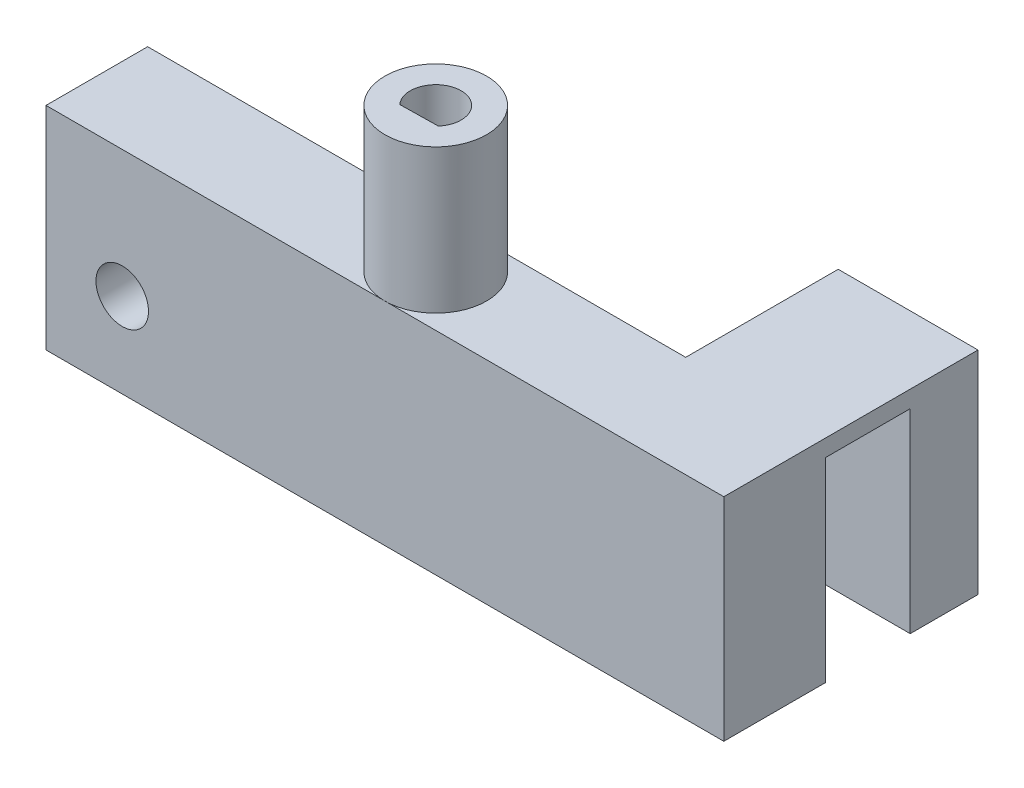
ISO-10303-21;
HEADER;
FILE_DESCRIPTION(('STEP AP214'),'2;1');
FILE_NAME('part.step','',(''),(''),'','','');
FILE_SCHEMA(('AUTOMOTIVE_DESIGN { 1 0 10303 214 1 1 1 1 }'));
ENDSEC;
DATA;
#1=APPLICATION_CONTEXT('core data for automotive mechanical design processes');
#2=APPLICATION_PROTOCOL_DEFINITION('international standard','automotive_design',2000,#1);
#3=PRODUCT_CONTEXT('',#1,'mechanical');
#4=PRODUCT('Part','Part','',(#3));
#5=PRODUCT_RELATED_PRODUCT_CATEGORY('part','',(#4));
#6=PRODUCT_DEFINITION_FORMATION('','',#4);
#7=PRODUCT_DEFINITION_CONTEXT('part definition',#1,'design');
#8=PRODUCT_DEFINITION('design','',#6,#7);
#9=PRODUCT_DEFINITION_SHAPE('','',#8);
#10=(LENGTH_UNIT() NAMED_UNIT(*) SI_UNIT(.MILLI.,.METRE.));
#11=(NAMED_UNIT(*) PLANE_ANGLE_UNIT() SI_UNIT($,.RADIAN.));
#12=(NAMED_UNIT(*) SI_UNIT($,.STERADIAN.) SOLID_ANGLE_UNIT());
#13=UNCERTAINTY_MEASURE_WITH_UNIT(LENGTH_MEASURE(1.E-05),#10,'distance_accuracy_value','');
#14=(GEOMETRIC_REPRESENTATION_CONTEXT(3) GLOBAL_UNCERTAINTY_ASSIGNED_CONTEXT((#13)) GLOBAL_UNIT_ASSIGNED_CONTEXT((#10,
#11,#12)) REPRESENTATION_CONTEXT('',''));
#15=CARTESIAN_POINT('',(0.,0.,0.));
#16=DIRECTION('',(0.,0.,1.));
#17=DIRECTION('',(1.,0.,0.));
#18=AXIS2_PLACEMENT_3D('',#15,#16,#17);
#19=CARTESIAN_POINT('',(0.,-12.5,0.));
#20=DIRECTION('',(0.,1.,0.));
#21=DIRECTION('',(0.,0.,1.));
#22=AXIS2_PLACEMENT_3D('',#19,#20,#21);
#23=PLANE('',#22);
#24=DIRECTION('',(1.,0.,0.));
#25=VECTOR('',#24,1.);
#26=CARTESIAN_POINT('',(-20.,-12.5,-3.));
#27=LINE('',#26,#25);
#28=CARTESIAN_POINT('',(-20.,-12.5,-3.));
#29=VERTEX_POINT('',#28);
#30=CARTESIAN_POINT('',(20.,-12.5,-3.));
#31=VERTEX_POINT('',#30);
#32=EDGE_CURVE('E185',#29,#31,#27,.T.);
#33=ORIENTED_EDGE('',*,*,#32,.T.);
#34=DIRECTION('',(0.,0.,1.));
#35=VECTOR('',#34,1.);
#36=CARTESIAN_POINT('',(20.,-12.5,-3.));
#37=LINE('',#36,#35);
#38=CARTESIAN_POINT('',(20.,-12.5,3.));
#39=VERTEX_POINT('',#38);
#40=EDGE_CURVE('E181',#31,#39,#37,.T.);
#41=ORIENTED_EDGE('',*,*,#40,.T.);
#42=DIRECTION('',(-1.,0.,0.));
#43=VECTOR('',#42,1.);
#44=CARTESIAN_POINT('',(-20.,-12.5,3.));
#45=LINE('',#44,#43);
#46=CARTESIAN_POINT('',(-20.,-12.5,3.));
#47=VERTEX_POINT('',#46);
#48=EDGE_CURVE('E180',#39,#47,#45,.T.);
#49=ORIENTED_EDGE('',*,*,#48,.T.);
#50=DIRECTION('',(0.,0.,-1.));
#51=VECTOR('',#50,1.);
#52=CARTESIAN_POINT('',(-20.,-12.5,-3.));
#53=LINE('',#52,#51);
#54=EDGE_CURVE('E183',#47,#29,#53,.T.);
#55=ORIENTED_EDGE('',*,*,#54,.T.);
#56=EDGE_LOOP('',(#33,#41,#49,#55));
#57=FACE_BOUND('',#56,.T.);
#58=ADVANCED_FACE('F38',(#57),#23,.F.);
#59=CARTESIAN_POINT('',(-20.,-12.5,-3.));
#60=DIRECTION('',(0.,0.,1.));
#61=DIRECTION('',(1.,0.,0.));
#62=AXIS2_PLACEMENT_3D('',#59,#60,#61);
#63=PLANE('',#62);
#64=CARTESIAN_POINT('',(-15.5,-7.5,-3.));
#65=DIRECTION('',(0.,0.,-1.));
#66=DIRECTION('',(-1.,0.,0.));
#67=AXIS2_PLACEMENT_3D('',#64,#65,#66);
#68=CIRCLE('',#67,1.55);
#69=CARTESIAN_POINT('',(-17.05,-7.5,-3.));
#70=VERTEX_POINT('',#69);
#71=EDGE_CURVE('E170',#70,#70,#68,.T.);
#72=ORIENTED_EDGE('',*,*,#71,.F.);
#73=EDGE_LOOP('',(#72));
#74=FACE_BOUND('',#73,.T.);
#75=DIRECTION('',(0.,1.,0.));
#76=VECTOR('',#75,1.);
#77=CARTESIAN_POINT('',(11.75,-12.5,-3.));
#78=LINE('',#77,#76);
#79=CARTESIAN_POINT('',(11.75,-1.,-3.));
#80=VERTEX_POINT('',#79);
#81=CARTESIAN_POINT('',(11.75,0.,-3.));
#82=VERTEX_POINT('',#81);
#83=EDGE_CURVE('E158',#80,#82,#78,.T.);
#84=ORIENTED_EDGE('',*,*,#83,.F.);
#85=DIRECTION('',(-1.,0.,0.));
#86=VECTOR('',#85,1.);
#87=CARTESIAN_POINT('',(11.75,-1.,-3.));
#88=LINE('',#87,#86);
#89=CARTESIAN_POINT('',(20.,-1.,-3.));
#90=VERTEX_POINT('',#89);
#91=EDGE_CURVE('E53',#90,#80,#88,.T.);
#92=ORIENTED_EDGE('',*,*,#91,.F.);
#93=DIRECTION('',(0.,-1.,0.));
#94=VECTOR('',#93,1.);
#95=CARTESIAN_POINT('',(20.,-1.,-3.));
#96=LINE('',#95,#94);
#97=EDGE_CURVE('E149',#90,#31,#96,.T.);
#98=ORIENTED_EDGE('',*,*,#97,.T.);
#99=ORIENTED_EDGE('',*,*,#32,.F.);
#100=DIRECTION('',(0.,1.,0.));
#101=VECTOR('',#100,1.);
#102=CARTESIAN_POINT('',(-20.,-12.5,-3.));
#103=LINE('',#102,#101);
#104=CARTESIAN_POINT('',(-20.,0.,-3.));
#105=VERTEX_POINT('',#104);
#106=EDGE_CURVE('E187',#29,#105,#103,.T.);
#107=ORIENTED_EDGE('',*,*,#106,.T.);
#108=DIRECTION('',(1.,0.,0.));
#109=VECTOR('',#108,1.);
#110=CARTESIAN_POINT('',(-20.,0.,-3.));
#111=LINE('',#110,#109);
#112=CARTESIAN_POINT('',(0.,0.,-3.));
#113=VERTEX_POINT('',#112);
#114=EDGE_CURVE('E195',#105,#113,#111,.T.);
#115=ORIENTED_EDGE('',*,*,#114,.T.);
#116=EDGE_CURVE('E194',#113,#82,#111,.T.);
#117=ORIENTED_EDGE('',*,*,#116,.T.);
#118=EDGE_LOOP('',(#84,#92,#98,#99,#107,#115,#117));
#119=FACE_BOUND('',#118,.T.);
#120=ADVANCED_FACE('F247',(#74,#119),#63,.F.);
#121=CARTESIAN_POINT('',(0.,8.5,0.));
#122=DIRECTION('',(0.,-1.,0.));
#123=DIRECTION('',(0.,0.,-1.));
#124=AXIS2_PLACEMENT_3D('',#121,#122,#123);
#125=CYLINDRICAL_SURFACE('',#124,3.);
#126=CARTESIAN_POINT('',(0.,8.5,0.));
#127=DIRECTION('',(0.,1.,0.));
#128=DIRECTION('',(0.,0.,1.));
#129=AXIS2_PLACEMENT_3D('',#126,#127,#128);
#130=CIRCLE('',#129,3.);
#131=CARTESIAN_POINT('',(0.,8.5,3.));
#132=VERTEX_POINT('',#131);
#133=EDGE_CURVE('E11',#132,#132,#130,.T.);
#134=ORIENTED_EDGE('',*,*,#133,.F.);
#135=EDGE_LOOP('',(#134));
#136=FACE_BOUND('',#135,.T.);
#137=CARTESIAN_POINT('',(0.,0.,0.));
#138=DIRECTION('',(0.,1.,0.));
#139=DIRECTION('',(0.,0.,1.));
#140=AXIS2_PLACEMENT_3D('',#137,#138,#139);
#141=CIRCLE('',#140,3.);
#142=CARTESIAN_POINT('',(0.,0.,3.));
#143=VERTEX_POINT('',#142);
#144=EDGE_CURVE('E42',#143,#113,#141,.T.);
#145=ORIENTED_EDGE('',*,*,#144,.T.);
#146=EDGE_CURVE('E219',#113,#143,#141,.T.);
#147=ORIENTED_EDGE('',*,*,#146,.T.);
#148=EDGE_LOOP('',(#145,#147));
#149=FACE_BOUND('',#148,.T.);
#150=ADVANCED_FACE('F40',(#136,#149),#125,.T.);
#151=CARTESIAN_POINT('',(0.,8.5,0.));
#152=DIRECTION('',(0.,1.,0.));
#153=DIRECTION('',(0.,0.,1.));
#154=AXIS2_PLACEMENT_3D('',#151,#152,#153);
#155=PLANE('',#154);
#156=CARTESIAN_POINT('',(0.,8.5,0.));
#157=DIRECTION('',(0.,1.,0.));
#158=DIRECTION('',(0.,0.,1.));
#159=AXIS2_PLACEMENT_3D('',#156,#157,#158);
#160=CIRCLE('',#159,1.5);
#161=CARTESIAN_POINT('',(1.13442926526062,8.5,0.981361422779732));
#162=VERTEX_POINT('',#161);
#163=CARTESIAN_POINT('',(-1.10133251917624,8.5,1.01836470981909));
#164=VERTEX_POINT('',#163);
#165=EDGE_CURVE('E205',#162,#164,#160,.T.);
#166=ORIENTED_EDGE('',*,*,#165,.F.);
#167=DIRECTION('',(0.999863066299409,0.,-0.0165483730421872));
#168=VECTOR('',#167,1.);
#169=CARTESIAN_POINT('',(-1.10133251917624,8.5,1.01836470981909));
#170=LINE('',#169,#168);
#171=EDGE_CURVE('E210',#164,#162,#170,.T.);
#172=ORIENTED_EDGE('',*,*,#171,.F.);
#173=EDGE_LOOP('',(#166,#172));
#174=FACE_BOUND('',#173,.T.);
#175=ORIENTED_EDGE('',*,*,#133,.T.);
#176=EDGE_LOOP('',(#175));
#177=FACE_BOUND('',#176,.T.);
#178=ADVANCED_FACE('F229',(#174,#177),#155,.T.);
#179=CARTESIAN_POINT('',(0.,2.5,0.));
#180=DIRECTION('',(0.,1.,0.));
#181=DIRECTION('',(0.,0.,1.));
#182=AXIS2_PLACEMENT_3D('',#179,#180,#181);
#183=CYLINDRICAL_SURFACE('',#182,1.5);
#184=ORIENTED_EDGE('',*,*,#165,.T.);
#185=DIRECTION('',(0.,1.,0.));
#186=VECTOR('',#185,1.);
#187=CARTESIAN_POINT('',(-1.10133251917624,2.5,1.01836470981909));
#188=LINE('',#187,#186);
#189=CARTESIAN_POINT('',(-1.10133251917624,2.5,1.01836470981909));
#190=VERTEX_POINT('',#189);
#191=EDGE_CURVE('E213',#190,#164,#188,.T.);
#192=ORIENTED_EDGE('',*,*,#191,.F.);
#193=CARTESIAN_POINT('',(0.,2.5,0.));
#194=DIRECTION('',(0.,1.,0.));
#195=DIRECTION('',(0.,0.,1.));
#196=AXIS2_PLACEMENT_3D('',#193,#194,#195);
#197=CIRCLE('',#196,1.5);
#198=CARTESIAN_POINT('',(1.13442926526062,2.5,0.981361422779732));
#199=VERTEX_POINT('',#198);
#200=EDGE_CURVE('E206',#199,#190,#197,.T.);
#201=ORIENTED_EDGE('',*,*,#200,.F.);
#202=DIRECTION('',(0.,1.,0.));
#203=VECTOR('',#202,1.);
#204=CARTESIAN_POINT('',(1.13442926526062,2.5,0.981361422779732));
#205=LINE('',#204,#203);
#206=EDGE_CURVE('E217',#199,#162,#205,.T.);
#207=ORIENTED_EDGE('',*,*,#206,.T.);
#208=EDGE_LOOP('',(#184,#192,#201,#207));
#209=FACE_BOUND('',#208,.T.);
#210=ADVANCED_FACE('F231',(#209),#183,.F.);
#211=CARTESIAN_POINT('',(-1.10133251917624,2.5,1.01836470981909));
#212=DIRECTION('',(0.0165483730421872,0.,0.999863066299409));
#213=DIRECTION('',(0.999863066299409,0.,-0.0165483730421872));
#214=AXIS2_PLACEMENT_3D('',#211,#212,#213);
#215=PLANE('',#214);
#216=ORIENTED_EDGE('',*,*,#171,.T.);
#217=ORIENTED_EDGE('',*,*,#206,.F.);
#218=DIRECTION('',(0.999863066299409,0.,-0.0165483730421872));
#219=VECTOR('',#218,1.);
#220=CARTESIAN_POINT('',(-1.10133251917624,2.5,1.01836470981909));
#221=LINE('',#220,#219);
#222=EDGE_CURVE('E209',#190,#199,#221,.T.);
#223=ORIENTED_EDGE('',*,*,#222,.F.);
#224=ORIENTED_EDGE('',*,*,#191,.T.);
#225=EDGE_LOOP('',(#216,#217,#223,#224));
#226=FACE_BOUND('',#225,.T.);
#227=ADVANCED_FACE('F224',(#226),#215,.F.);
#228=CARTESIAN_POINT('',(0.,2.5,0.));
#229=DIRECTION('',(0.,1.,0.));
#230=DIRECTION('',(0.,0.,1.));
#231=AXIS2_PLACEMENT_3D('',#228,#229,#230);
#232=PLANE('',#231);
#233=ORIENTED_EDGE('',*,*,#200,.T.);
#234=ORIENTED_EDGE('',*,*,#222,.T.);
#235=EDGE_LOOP('',(#233,#234));
#236=FACE_BOUND('',#235,.T.);
#237=ADVANCED_FACE('F233',(#236),#232,.T.);
#238=CARTESIAN_POINT('',(0.,0.,0.));
#239=DIRECTION('',(0.,1.,0.));
#240=DIRECTION('',(0.,0.,1.));
#241=AXIS2_PLACEMENT_3D('',#238,#239,#240);
#242=PLANE('',#241);
#243=ORIENTED_EDGE('',*,*,#144,.F.);
#244=DIRECTION('',(-1.,0.,0.));
#245=VECTOR('',#244,1.);
#246=CARTESIAN_POINT('',(-20.,0.,3.));
#247=LINE('',#246,#245);
#248=CARTESIAN_POINT('',(20.,0.,3.));
#249=VERTEX_POINT('',#248);
#250=EDGE_CURVE('E61',#249,#143,#247,.T.);
#251=ORIENTED_EDGE('',*,*,#250,.F.);
#252=DIRECTION('',(0.,0.,1.));
#253=VECTOR('',#252,1.);
#254=CARTESIAN_POINT('',(20.,0.,-3.));
#255=LINE('',#254,#253);
#256=CARTESIAN_POINT('',(20.,0.,-12.));
#257=VERTEX_POINT('',#256);
#258=EDGE_CURVE('E174',#257,#249,#255,.T.);
#259=ORIENTED_EDGE('',*,*,#258,.F.);
#260=DIRECTION('',(1.,0.,0.));
#261=VECTOR('',#260,1.);
#262=CARTESIAN_POINT('',(20.,0.,-12.));
#263=LINE('',#262,#261);
#264=CARTESIAN_POINT('',(11.75,0.,-12.));
#265=VERTEX_POINT('',#264);
#266=EDGE_CURVE('E162',#265,#257,#263,.T.);
#267=ORIENTED_EDGE('',*,*,#266,.F.);
#268=DIRECTION('',(0.,0.,1.));
#269=VECTOR('',#268,1.);
#270=CARTESIAN_POINT('',(11.75,0.,-12.));
#271=LINE('',#270,#269);
#272=EDGE_CURVE('E165',#265,#82,#271,.T.);
#273=ORIENTED_EDGE('',*,*,#272,.T.);
#274=ORIENTED_EDGE('',*,*,#116,.F.);
#275=EDGE_LOOP('',(#243,#251,#259,#267,#273,#274));
#276=FACE_BOUND('',#275,.T.);
#277=ADVANCED_FACE('F235',(#276),#242,.T.);
#278=ORIENTED_EDGE('',*,*,#146,.F.);
#279=ORIENTED_EDGE('',*,*,#114,.F.);
#280=DIRECTION('',(0.,0.,-1.));
#281=VECTOR('',#280,1.);
#282=CARTESIAN_POINT('',(-20.,0.,-3.));
#283=LINE('',#282,#281);
#284=CARTESIAN_POINT('',(-20.,0.,3.));
#285=VERTEX_POINT('',#284);
#286=EDGE_CURVE('E192',#285,#105,#283,.T.);
#287=ORIENTED_EDGE('',*,*,#286,.F.);
#288=EDGE_CURVE('E190',#143,#285,#247,.T.);
#289=ORIENTED_EDGE('',*,*,#288,.F.);
#290=EDGE_LOOP('',(#278,#279,#287,#289));
#291=FACE_BOUND('',#290,.T.);
#292=ADVANCED_FACE('F241',(#291),#242,.T.);
#293=CARTESIAN_POINT('',(20.,-12.5,-3.));
#294=DIRECTION('',(-1.,0.,0.));
#295=DIRECTION('',(0.,0.,1.));
#296=AXIS2_PLACEMENT_3D('',#293,#294,#295);
#297=PLANE('',#296);
#298=ORIENTED_EDGE('',*,*,#40,.F.);
#299=ORIENTED_EDGE('',*,*,#97,.F.);
#300=DIRECTION('',(0.,0.,1.));
#301=VECTOR('',#300,1.);
#302=CARTESIAN_POINT('',(20.,-1.,-3.));
#303=LINE('',#302,#301);
#304=CARTESIAN_POINT('',(20.,-1.,-8.));
#305=VERTEX_POINT('',#304);
#306=EDGE_CURVE('E135',#305,#90,#303,.T.);
#307=ORIENTED_EDGE('',*,*,#306,.F.);
#308=DIRECTION('',(0.,-1.,0.));
#309=VECTOR('',#308,1.);
#310=CARTESIAN_POINT('',(20.,-1.,-8.));
#311=LINE('',#310,#309);
#312=CARTESIAN_POINT('',(20.,-12.5,-8.));
#313=VERTEX_POINT('',#312);
#314=EDGE_CURVE('E133',#305,#313,#311,.T.);
#315=ORIENTED_EDGE('',*,*,#314,.T.);
#316=CARTESIAN_POINT('',(20.,-12.5,-12.));
#317=VERTEX_POINT('',#316);
#318=EDGE_CURVE('E177',#317,#313,#37,.T.);
#319=ORIENTED_EDGE('',*,*,#318,.F.);
#320=DIRECTION('',(0.,-1.,0.));
#321=VECTOR('',#320,1.);
#322=CARTESIAN_POINT('',(20.,-12.5,-12.));
#323=LINE('',#322,#321);
#324=EDGE_CURVE('E154',#257,#317,#323,.T.);
#325=ORIENTED_EDGE('',*,*,#324,.F.);
#326=ORIENTED_EDGE('',*,*,#258,.T.);
#327=DIRECTION('',(0.,1.,0.));
#328=VECTOR('',#327,1.);
#329=CARTESIAN_POINT('',(20.,-12.5,3.));
#330=LINE('',#329,#328);
#331=EDGE_CURVE('E203',#39,#249,#330,.T.);
#332=ORIENTED_EDGE('',*,*,#331,.F.);
#333=EDGE_LOOP('',(#298,#299,#307,#315,#319,#325,#326,#332));
#334=FACE_BOUND('',#333,.T.);
#335=ADVANCED_FACE('F273',(#334),#297,.F.);
#336=CARTESIAN_POINT('',(-20.,-12.5,3.));
#337=DIRECTION('',(0.,0.,-1.));
#338=DIRECTION('',(-1.,0.,0.));
#339=AXIS2_PLACEMENT_3D('',#336,#337,#338);
#340=PLANE('',#339);
#341=CARTESIAN_POINT('',(-15.5,-7.5,3.));
#342=DIRECTION('',(0.,0.,-1.));
#343=DIRECTION('',(-1.,0.,0.));
#344=AXIS2_PLACEMENT_3D('',#341,#342,#343);
#345=CIRCLE('',#344,1.55);
#346=CARTESIAN_POINT('',(-17.05,-7.5,3.));
#347=VERTEX_POINT('',#346);
#348=EDGE_CURVE('E171',#347,#347,#345,.T.);
#349=ORIENTED_EDGE('',*,*,#348,.T.);
#350=EDGE_LOOP('',(#349));
#351=FACE_BOUND('',#350,.T.);
#352=ORIENTED_EDGE('',*,*,#250,.T.);
#353=ORIENTED_EDGE('',*,*,#288,.T.);
#354=DIRECTION('',(0.,1.,0.));
#355=VECTOR('',#354,1.);
#356=CARTESIAN_POINT('',(-20.,-12.5,3.));
#357=LINE('',#356,#355);
#358=EDGE_CURVE('E200',#47,#285,#357,.T.);
#359=ORIENTED_EDGE('',*,*,#358,.F.);
#360=ORIENTED_EDGE('',*,*,#48,.F.);
#361=ORIENTED_EDGE('',*,*,#331,.T.);
#362=EDGE_LOOP('',(#352,#353,#359,#360,#361));
#363=FACE_BOUND('',#362,.T.);
#364=ADVANCED_FACE('F266',(#351,#363),#340,.F.);
#365=CARTESIAN_POINT('',(-20.,-12.5,-3.));
#366=DIRECTION('',(1.,0.,0.));
#367=DIRECTION('',(0.,0.,-1.));
#368=AXIS2_PLACEMENT_3D('',#365,#366,#367);
#369=PLANE('',#368);
#370=ORIENTED_EDGE('',*,*,#286,.T.);
#371=ORIENTED_EDGE('',*,*,#106,.F.);
#372=ORIENTED_EDGE('',*,*,#54,.F.);
#373=ORIENTED_EDGE('',*,*,#358,.T.);
#374=EDGE_LOOP('',(#370,#371,#372,#373));
#375=FACE_BOUND('',#374,.T.);
#376=ADVANCED_FACE('F259',(#375),#369,.F.);
#377=ORIENTED_EDGE('',*,*,#318,.T.);
#378=DIRECTION('',(1.,0.,0.));
#379=VECTOR('',#378,1.);
#380=CARTESIAN_POINT('',(11.75,-12.5,-8.));
#381=LINE('',#380,#379);
#382=CARTESIAN_POINT('',(11.75,-12.5,-8.));
#383=VERTEX_POINT('',#382);
#384=EDGE_CURVE('E141',#383,#313,#381,.T.);
#385=ORIENTED_EDGE('',*,*,#384,.F.);
#386=DIRECTION('',(0.,0.,1.));
#387=VECTOR('',#386,1.);
#388=CARTESIAN_POINT('',(11.75,-12.5,-12.));
#389=LINE('',#388,#387);
#390=CARTESIAN_POINT('',(11.75,-12.5,-12.));
#391=VERTEX_POINT('',#390);
#392=EDGE_CURVE('E147',#391,#383,#389,.T.);
#393=ORIENTED_EDGE('',*,*,#392,.F.);
#394=DIRECTION('',(-1.,0.,0.));
#395=VECTOR('',#394,1.);
#396=CARTESIAN_POINT('',(20.,-12.5,-12.));
#397=LINE('',#396,#395);
#398=EDGE_CURVE('E157',#317,#391,#397,.T.);
#399=ORIENTED_EDGE('',*,*,#398,.F.);
#400=EDGE_LOOP('',(#377,#385,#393,#399));
#401=FACE_BOUND('',#400,.T.);
#402=ADVANCED_FACE('F250',(#401),#23,.F.);
#403=CARTESIAN_POINT('',(-15.5,-7.5,3.));
#404=DIRECTION('',(0.,0.,-1.));
#405=DIRECTION('',(-1.,0.,0.));
#406=AXIS2_PLACEMENT_3D('',#403,#404,#405);
#407=CYLINDRICAL_SURFACE('',#406,1.55);
#408=ORIENTED_EDGE('',*,*,#348,.F.);
#409=EDGE_LOOP('',(#408));
#410=FACE_BOUND('',#409,.T.);
#411=ORIENTED_EDGE('',*,*,#71,.T.);
#412=EDGE_LOOP('',(#411));
#413=FACE_BOUND('',#412,.T.);
#414=ADVANCED_FACE('F258',(#410,#413),#407,.F.);
#415=CARTESIAN_POINT('',(11.75,-12.5,-12.));
#416=DIRECTION('',(1.,0.,0.));
#417=DIRECTION('',(0.,0.,-1.));
#418=AXIS2_PLACEMENT_3D('',#415,#416,#417);
#419=PLANE('',#418);
#420=ORIENTED_EDGE('',*,*,#392,.T.);
#421=DIRECTION('',(0.,-1.,0.));
#422=VECTOR('',#421,1.);
#423=CARTESIAN_POINT('',(11.75,-1.,-8.));
#424=LINE('',#423,#422);
#425=CARTESIAN_POINT('',(11.75,-1.,-8.));
#426=VERTEX_POINT('',#425);
#427=EDGE_CURVE('E130',#426,#383,#424,.T.);
#428=ORIENTED_EDGE('',*,*,#427,.F.);
#429=DIRECTION('',(0.,0.,-1.));
#430=VECTOR('',#429,1.);
#431=CARTESIAN_POINT('',(11.75,-1.,-3.));
#432=LINE('',#431,#430);
#433=EDGE_CURVE('E136',#80,#426,#432,.T.);
#434=ORIENTED_EDGE('',*,*,#433,.F.);
#435=ORIENTED_EDGE('',*,*,#83,.T.);
#436=ORIENTED_EDGE('',*,*,#272,.F.);
#437=DIRECTION('',(0.,1.,0.));
#438=VECTOR('',#437,1.);
#439=CARTESIAN_POINT('',(11.75,-12.5,-12.));
#440=LINE('',#439,#438);
#441=EDGE_CURVE('E160',#391,#265,#440,.T.);
#442=ORIENTED_EDGE('',*,*,#441,.F.);
#443=EDGE_LOOP('',(#420,#428,#434,#435,#436,#442));
#444=FACE_BOUND('',#443,.T.);
#445=ADVANCED_FACE('F144',(#444),#419,.F.);
#446=CARTESIAN_POINT('',(0.,0.,-12.));
#447=DIRECTION('',(0.,0.,1.));
#448=DIRECTION('',(1.,0.,0.));
#449=AXIS2_PLACEMENT_3D('',#446,#447,#448);
#450=PLANE('',#449);
#451=ORIENTED_EDGE('',*,*,#324,.T.);
#452=ORIENTED_EDGE('',*,*,#398,.T.);
#453=ORIENTED_EDGE('',*,*,#441,.T.);
#454=ORIENTED_EDGE('',*,*,#266,.T.);
#455=EDGE_LOOP('',(#451,#452,#453,#454));
#456=FACE_BOUND('',#455,.T.);
#457=ADVANCED_FACE('F297',(#456),#450,.F.);
#458=CARTESIAN_POINT('',(11.75,-1.,-8.));
#459=DIRECTION('',(0.,0.,-1.));
#460=DIRECTION('',(-1.,0.,0.));
#461=AXIS2_PLACEMENT_3D('',#458,#459,#460);
#462=PLANE('',#461);
#463=ORIENTED_EDGE('',*,*,#384,.T.);
#464=ORIENTED_EDGE('',*,*,#314,.F.);
#465=DIRECTION('',(1.,0.,0.));
#466=VECTOR('',#465,1.);
#467=CARTESIAN_POINT('',(11.75,-1.,-8.));
#468=LINE('',#467,#466);
#469=EDGE_CURVE('E127',#426,#305,#468,.T.);
#470=ORIENTED_EDGE('',*,*,#469,.F.);
#471=ORIENTED_EDGE('',*,*,#427,.T.);
#472=EDGE_LOOP('',(#463,#464,#470,#471));
#473=FACE_BOUND('',#472,.T.);
#474=ADVANCED_FACE('F128',(#473),#462,.F.);
#475=CARTESIAN_POINT('',(0.,-1.,0.));
#476=DIRECTION('',(0.,-1.,0.));
#477=DIRECTION('',(0.,0.,-1.));
#478=AXIS2_PLACEMENT_3D('',#475,#476,#477);
#479=PLANE('',#478);
#480=ORIENTED_EDGE('',*,*,#433,.T.);
#481=ORIENTED_EDGE('',*,*,#469,.T.);
#482=ORIENTED_EDGE('',*,*,#306,.T.);
#483=ORIENTED_EDGE('',*,*,#91,.T.);
#484=EDGE_LOOP('',(#480,#481,#482,#483));
#485=FACE_BOUND('',#484,.T.);
#486=ADVANCED_FACE('F138',(#485),#479,.T.);
#487=CLOSED_SHELL('',(#58,#120,#150,#178,#210,#227,#237,#277,#292,#335,#364,#376,#402,#414,#445,
#457,#474,#486));
#488=MANIFOLD_SOLID_BREP('B2',#487);
#489=ADVANCED_BREP_SHAPE_REPRESENTATION('',(#18,#488),#14);
#490=SHAPE_DEFINITION_REPRESENTATION(#9,#489);
ENDSEC;
END-ISO-10303-21;
